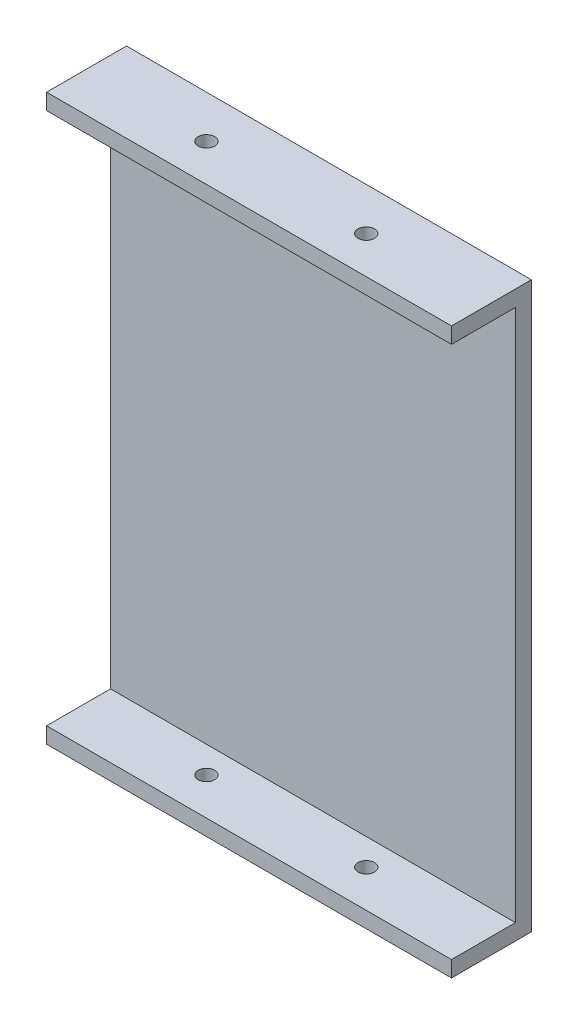
ISO-10303-21;
HEADER;
FILE_DESCRIPTION(('STEP AP214'),'2;1');
FILE_NAME('part.step','',(''),(''),'','','');
FILE_SCHEMA(('AUTOMOTIVE_DESIGN { 1 0 10303 214 1 1 1 1 }'));
ENDSEC;
DATA;
#1=APPLICATION_CONTEXT('core data for automotive mechanical design processes');
#2=APPLICATION_PROTOCOL_DEFINITION('international standard','automotive_design',2000,#1);
#3=PRODUCT_CONTEXT('',#1,'mechanical');
#4=PRODUCT('Part','Part','',(#3));
#5=PRODUCT_RELATED_PRODUCT_CATEGORY('part','',(#4));
#6=PRODUCT_DEFINITION_FORMATION('','',#4);
#7=PRODUCT_DEFINITION_CONTEXT('part definition',#1,'design');
#8=PRODUCT_DEFINITION('design','',#6,#7);
#9=PRODUCT_DEFINITION_SHAPE('','',#8);
#10=(LENGTH_UNIT() NAMED_UNIT(*) SI_UNIT(.MILLI.,.METRE.));
#11=(NAMED_UNIT(*) PLANE_ANGLE_UNIT() SI_UNIT($,.RADIAN.));
#12=(NAMED_UNIT(*) SI_UNIT($,.STERADIAN.) SOLID_ANGLE_UNIT());
#13=UNCERTAINTY_MEASURE_WITH_UNIT(LENGTH_MEASURE(1.E-05),#10,'distance_accuracy_value','');
#14=(GEOMETRIC_REPRESENTATION_CONTEXT(3) GLOBAL_UNCERTAINTY_ASSIGNED_CONTEXT((#13)) GLOBAL_UNIT_ASSIGNED_CONTEXT((#10,
#11,#12)) REPRESENTATION_CONTEXT('',''));
#15=CARTESIAN_POINT('',(0.,0.,0.));
#16=DIRECTION('',(0.,0.,1.));
#17=DIRECTION('',(1.,0.,0.));
#18=AXIS2_PLACEMENT_3D('',#15,#16,#17);
#19=CARTESIAN_POINT('',(0.,0.,3.));
#20=DIRECTION('',(0.,0.,-1.));
#21=DIRECTION('',(-1.,0.,0.));
#22=AXIS2_PLACEMENT_3D('',#19,#20,#21);
#23=PLANE('',#22);
#24=DIRECTION('',(-1.,0.,0.));
#25=VECTOR('',#24,1.);
#26=CARTESIAN_POINT('',(0.,45.,3.));
#27=LINE('',#26,#25);
#28=CARTESIAN_POINT('',(76.,45.,3.));
#29=VERTEX_POINT('',#28);
#30=CARTESIAN_POINT('',(0.,45.,3.));
#31=VERTEX_POINT('',#30);
#32=EDGE_CURVE('E62',#29,#31,#27,.T.);
#33=ORIENTED_EDGE('',*,*,#32,.F.);
#34=DIRECTION('',(0.,1.,0.));
#35=VECTOR('',#34,1.);
#36=CARTESIAN_POINT('',(76.,0.,3.));
#37=LINE('',#36,#35);
#38=CARTESIAN_POINT('',(76.,145.,3.));
#39=VERTEX_POINT('',#38);
#40=EDGE_CURVE('E11',#29,#39,#37,.T.);
#41=ORIENTED_EDGE('',*,*,#40,.T.);
#42=DIRECTION('',(1.,0.,0.));
#43=VECTOR('',#42,1.);
#44=CARTESIAN_POINT('',(0.,145.,3.));
#45=LINE('',#44,#43);
#46=CARTESIAN_POINT('',(0.,145.,3.));
#47=VERTEX_POINT('',#46);
#48=EDGE_CURVE('E197',#47,#39,#45,.T.);
#49=ORIENTED_EDGE('',*,*,#48,.F.);
#50=DIRECTION('',(0.,-1.,0.));
#51=VECTOR('',#50,1.);
#52=CARTESIAN_POINT('',(0.,0.,3.));
#53=LINE('',#52,#51);
#54=EDGE_CURVE('E55',#47,#31,#53,.T.);
#55=ORIENTED_EDGE('',*,*,#54,.T.);
#56=EDGE_LOOP('',(#33,#41,#49,#55));
#57=FACE_BOUND('',#56,.T.);
#58=ADVANCED_FACE('F45',(#57),#23,.F.);
#59=CARTESIAN_POINT('',(0.,0.,0.));
#60=DIRECTION('',(0.,0.,-1.));
#61=DIRECTION('',(-1.,0.,0.));
#62=AXIS2_PLACEMENT_3D('',#59,#60,#61);
#63=PLANE('',#62);
#64=DIRECTION('',(1.,0.,0.));
#65=VECTOR('',#64,1.);
#66=CARTESIAN_POINT('',(0.,42.,0.));
#67=LINE('',#66,#65);
#68=CARTESIAN_POINT('',(0.,42.,0.));
#69=VERTEX_POINT('',#68);
#70=CARTESIAN_POINT('',(76.,42.,0.));
#71=VERTEX_POINT('',#70);
#72=EDGE_CURVE('E132',#69,#71,#67,.T.);
#73=ORIENTED_EDGE('',*,*,#72,.F.);
#74=DIRECTION('',(0.,-1.,0.));
#75=VECTOR('',#74,1.);
#76=CARTESIAN_POINT('',(0.,0.,0.));
#77=LINE('',#76,#75);
#78=CARTESIAN_POINT('',(0.,148.,0.));
#79=VERTEX_POINT('',#78);
#80=EDGE_CURVE('E114',#79,#69,#77,.T.);
#81=ORIENTED_EDGE('',*,*,#80,.F.);
#82=DIRECTION('',(-1.,0.,0.));
#83=VECTOR('',#82,1.);
#84=CARTESIAN_POINT('',(0.,148.,0.));
#85=LINE('',#84,#83);
#86=CARTESIAN_POINT('',(76.,148.,0.));
#87=VERTEX_POINT('',#86);
#88=EDGE_CURVE('E125',#87,#79,#85,.T.);
#89=ORIENTED_EDGE('',*,*,#88,.F.);
#90=DIRECTION('',(0.,1.,0.));
#91=VECTOR('',#90,1.);
#92=CARTESIAN_POINT('',(76.,0.,0.));
#93=LINE('',#92,#91);
#94=EDGE_CURVE('E138',#71,#87,#93,.T.);
#95=ORIENTED_EDGE('',*,*,#94,.F.);
#96=EDGE_LOOP('',(#73,#81,#89,#95));
#97=FACE_BOUND('',#96,.T.);
#98=ADVANCED_FACE('F135',(#97),#63,.T.);
#99=CARTESIAN_POINT('',(0.,0.,3.));
#100=DIRECTION('',(1.,0.,0.));
#101=DIRECTION('',(0.,0.,-1.));
#102=AXIS2_PLACEMENT_3D('',#99,#100,#101);
#103=PLANE('',#102);
#104=ORIENTED_EDGE('',*,*,#80,.T.);
#105=DIRECTION('',(0.,0.,-1.));
#106=VECTOR('',#105,1.);
#107=CARTESIAN_POINT('',(0.,42.,15.));
#108=LINE('',#107,#106);
#109=CARTESIAN_POINT('',(0.,42.,15.));
#110=VERTEX_POINT('',#109);
#111=EDGE_CURVE('E139',#110,#69,#108,.T.);
#112=ORIENTED_EDGE('',*,*,#111,.F.);
#113=DIRECTION('',(0.,-1.,0.));
#114=VECTOR('',#113,1.);
#115=CARTESIAN_POINT('',(0.,45.,15.));
#116=LINE('',#115,#114);
#117=CARTESIAN_POINT('',(0.,45.,15.));
#118=VERTEX_POINT('',#117);
#119=EDGE_CURVE('E181',#118,#110,#116,.T.);
#120=ORIENTED_EDGE('',*,*,#119,.F.);
#121=DIRECTION('',(0.,0.,-1.));
#122=VECTOR('',#121,1.);
#123=CARTESIAN_POINT('',(0.,45.,15.));
#124=LINE('',#123,#122);
#125=EDGE_CURVE('E194',#118,#31,#124,.T.);
#126=ORIENTED_EDGE('',*,*,#125,.T.);
#127=ORIENTED_EDGE('',*,*,#54,.F.);
#128=DIRECTION('',(0.,0.,-1.));
#129=VECTOR('',#128,1.);
#130=CARTESIAN_POINT('',(0.,145.,15.));
#131=LINE('',#130,#129);
#132=CARTESIAN_POINT('',(0.,145.,15.));
#133=VERTEX_POINT('',#132);
#134=EDGE_CURVE('E180',#133,#47,#131,.T.);
#135=ORIENTED_EDGE('',*,*,#134,.F.);
#136=DIRECTION('',(0.,-1.,0.));
#137=VECTOR('',#136,1.);
#138=CARTESIAN_POINT('',(0.,148.,15.));
#139=LINE('',#138,#137);
#140=CARTESIAN_POINT('',(0.,148.,15.));
#141=VERTEX_POINT('',#140);
#142=EDGE_CURVE('E117',#141,#133,#139,.T.);
#143=ORIENTED_EDGE('',*,*,#142,.F.);
#144=DIRECTION('',(0.,0.,-1.));
#145=VECTOR('',#144,1.);
#146=CARTESIAN_POINT('',(0.,148.,15.));
#147=LINE('',#146,#145);
#148=EDGE_CURVE('E110',#141,#79,#147,.T.);
#149=ORIENTED_EDGE('',*,*,#148,.T.);
#150=EDGE_LOOP('',(#104,#112,#120,#126,#127,#135,#143,#149));
#151=FACE_BOUND('',#150,.T.);
#152=ADVANCED_FACE('F47',(#151),#103,.F.);
#153=CARTESIAN_POINT('',(76.,0.,3.));
#154=DIRECTION('',(-1.,0.,0.));
#155=DIRECTION('',(0.,0.,1.));
#156=AXIS2_PLACEMENT_3D('',#153,#154,#155);
#157=PLANE('',#156);
#158=DIRECTION('',(0.,0.,-1.));
#159=VECTOR('',#158,1.);
#160=CARTESIAN_POINT('',(76.,42.,15.));
#161=LINE('',#160,#159);
#162=CARTESIAN_POINT('',(76.,42.,15.));
#163=VERTEX_POINT('',#162);
#164=EDGE_CURVE('E144',#163,#71,#161,.T.);
#165=ORIENTED_EDGE('',*,*,#164,.T.);
#166=ORIENTED_EDGE('',*,*,#94,.T.);
#167=DIRECTION('',(0.,0.,-1.));
#168=VECTOR('',#167,1.);
#169=CARTESIAN_POINT('',(76.,148.,15.));
#170=LINE('',#169,#168);
#171=CARTESIAN_POINT('',(76.,148.,15.));
#172=VERTEX_POINT('',#171);
#173=EDGE_CURVE('E122',#172,#87,#170,.T.);
#174=ORIENTED_EDGE('',*,*,#173,.F.);
#175=DIRECTION('',(0.,1.,0.));
#176=VECTOR('',#175,1.);
#177=CARTESIAN_POINT('',(76.,148.,15.));
#178=LINE('',#177,#176);
#179=CARTESIAN_POINT('',(76.,145.,15.));
#180=VERTEX_POINT('',#179);
#181=EDGE_CURVE('E221',#180,#172,#178,.T.);
#182=ORIENTED_EDGE('',*,*,#181,.F.);
#183=DIRECTION('',(0.,0.,-1.));
#184=VECTOR('',#183,1.);
#185=CARTESIAN_POINT('',(76.,145.,15.));
#186=LINE('',#185,#184);
#187=EDGE_CURVE('E210',#180,#39,#186,.T.);
#188=ORIENTED_EDGE('',*,*,#187,.T.);
#189=ORIENTED_EDGE('',*,*,#40,.F.);
#190=DIRECTION('',(0.,0.,-1.));
#191=VECTOR('',#190,1.);
#192=CARTESIAN_POINT('',(76.,45.,15.));
#193=LINE('',#192,#191);
#194=CARTESIAN_POINT('',(76.,45.,15.));
#195=VERTEX_POINT('',#194);
#196=EDGE_CURVE('E201',#195,#29,#193,.T.);
#197=ORIENTED_EDGE('',*,*,#196,.F.);
#198=DIRECTION('',(0.,1.,0.));
#199=VECTOR('',#198,1.);
#200=CARTESIAN_POINT('',(76.,45.,15.));
#201=LINE('',#200,#199);
#202=EDGE_CURVE('E188',#163,#195,#201,.T.);
#203=ORIENTED_EDGE('',*,*,#202,.F.);
#204=EDGE_LOOP('',(#165,#166,#174,#182,#188,#189,#197,#203));
#205=FACE_BOUND('',#204,.T.);
#206=ADVANCED_FACE('F236',(#205),#157,.F.);
#207=CARTESIAN_POINT('',(0.,145.,15.));
#208=DIRECTION('',(0.,1.,0.));
#209=DIRECTION('',(0.,0.,1.));
#210=AXIS2_PLACEMENT_3D('',#207,#208,#209);
#211=PLANE('',#210);
#212=CARTESIAN_POINT('',(23.,145.,8.));
#213=DIRECTION('',(0.,1.,0.));
#214=DIRECTION('',(0.,0.,1.));
#215=AXIS2_PLACEMENT_3D('',#212,#213,#214);
#216=CIRCLE('',#215,1.55);
#217=CARTESIAN_POINT('',(23.,145.,9.55));
#218=VERTEX_POINT('',#217);
#219=EDGE_CURVE('E176',#218,#218,#216,.T.);
#220=ORIENTED_EDGE('',*,*,#219,.T.);
#221=EDGE_LOOP('',(#220));
#222=FACE_BOUND('',#221,.T.);
#223=CARTESIAN_POINT('',(53.,145.,8.));
#224=DIRECTION('',(0.,1.,0.));
#225=DIRECTION('',(0.,0.,1.));
#226=AXIS2_PLACEMENT_3D('',#223,#224,#225);
#227=CIRCLE('',#226,1.55);
#228=CARTESIAN_POINT('',(53.,145.,9.55));
#229=VERTEX_POINT('',#228);
#230=EDGE_CURVE('E157',#229,#229,#227,.T.);
#231=ORIENTED_EDGE('',*,*,#230,.T.);
#232=EDGE_LOOP('',(#231));
#233=FACE_BOUND('',#232,.T.);
#234=ORIENTED_EDGE('',*,*,#48,.T.);
#235=ORIENTED_EDGE('',*,*,#187,.F.);
#236=DIRECTION('',(1.,0.,0.));
#237=VECTOR('',#236,1.);
#238=CARTESIAN_POINT('',(0.,145.,15.));
#239=LINE('',#238,#237);
#240=EDGE_CURVE('E224',#133,#180,#239,.T.);
#241=ORIENTED_EDGE('',*,*,#240,.F.);
#242=ORIENTED_EDGE('',*,*,#134,.T.);
#243=EDGE_LOOP('',(#234,#235,#241,#242));
#244=FACE_BOUND('',#243,.T.);
#245=ADVANCED_FACE('F233',(#222,#233,#244),#211,.F.);
#246=CARTESIAN_POINT('',(0.,148.,15.));
#247=DIRECTION('',(0.,-1.,0.));
#248=DIRECTION('',(0.,0.,-1.));
#249=AXIS2_PLACEMENT_3D('',#246,#247,#248);
#250=PLANE('',#249);
#251=CARTESIAN_POINT('',(23.,148.,8.));
#252=DIRECTION('',(0.,-1.,0.));
#253=DIRECTION('',(0.,0.,-1.));
#254=AXIS2_PLACEMENT_3D('',#251,#252,#253);
#255=CIRCLE('',#254,1.55);
#256=CARTESIAN_POINT('',(23.,148.,6.45));
#257=VERTEX_POINT('',#256);
#258=EDGE_CURVE('E172',#257,#257,#255,.T.);
#259=ORIENTED_EDGE('',*,*,#258,.T.);
#260=EDGE_LOOP('',(#259));
#261=FACE_BOUND('',#260,.T.);
#262=CARTESIAN_POINT('',(53.,148.,8.));
#263=DIRECTION('',(0.,-1.,0.));
#264=DIRECTION('',(0.,0.,-1.));
#265=AXIS2_PLACEMENT_3D('',#262,#263,#264);
#266=CIRCLE('',#265,1.55);
#267=CARTESIAN_POINT('',(53.,148.,6.45));
#268=VERTEX_POINT('',#267);
#269=EDGE_CURVE('E150',#268,#268,#266,.T.);
#270=ORIENTED_EDGE('',*,*,#269,.T.);
#271=EDGE_LOOP('',(#270));
#272=FACE_BOUND('',#271,.T.);
#273=ORIENTED_EDGE('',*,*,#173,.T.);
#274=ORIENTED_EDGE('',*,*,#88,.T.);
#275=ORIENTED_EDGE('',*,*,#148,.F.);
#276=DIRECTION('',(-1.,0.,0.));
#277=VECTOR('',#276,1.);
#278=CARTESIAN_POINT('',(0.,148.,15.));
#279=LINE('',#278,#277);
#280=EDGE_CURVE('E121',#172,#141,#279,.T.);
#281=ORIENTED_EDGE('',*,*,#280,.F.);
#282=EDGE_LOOP('',(#273,#274,#275,#281));
#283=FACE_BOUND('',#282,.T.);
#284=ADVANCED_FACE('F126',(#261,#272,#283),#250,.F.);
#285=CARTESIAN_POINT('',(0.,0.,15.));
#286=DIRECTION('',(0.,0.,1.));
#287=DIRECTION('',(1.,0.,0.));
#288=AXIS2_PLACEMENT_3D('',#285,#286,#287);
#289=PLANE('',#288);
#290=ORIENTED_EDGE('',*,*,#142,.T.);
#291=ORIENTED_EDGE('',*,*,#240,.T.);
#292=ORIENTED_EDGE('',*,*,#181,.T.);
#293=ORIENTED_EDGE('',*,*,#280,.T.);
#294=EDGE_LOOP('',(#290,#291,#292,#293));
#295=FACE_BOUND('',#294,.T.);
#296=ADVANCED_FACE('F230',(#295),#289,.T.);
#297=CARTESIAN_POINT('',(0.,42.,15.));
#298=DIRECTION('',(0.,1.,0.));
#299=DIRECTION('',(0.,0.,1.));
#300=AXIS2_PLACEMENT_3D('',#297,#298,#299);
#301=PLANE('',#300);
#302=CARTESIAN_POINT('',(23.,42.,8.));
#303=DIRECTION('',(0.,-1.,0.));
#304=DIRECTION('',(0.,0.,-1.));
#305=AXIS2_PLACEMENT_3D('',#302,#303,#304);
#306=CIRCLE('',#305,1.55);
#307=CARTESIAN_POINT('',(23.,42.,6.45));
#308=VERTEX_POINT('',#307);
#309=EDGE_CURVE('E151',#308,#308,#306,.T.);
#310=ORIENTED_EDGE('',*,*,#309,.F.);
#311=EDGE_LOOP('',(#310));
#312=FACE_BOUND('',#311,.T.);
#313=CARTESIAN_POINT('',(53.,42.,8.));
#314=DIRECTION('',(0.,-1.,0.));
#315=DIRECTION('',(0.,0.,-1.));
#316=AXIS2_PLACEMENT_3D('',#313,#314,#315);
#317=CIRCLE('',#316,1.55);
#318=CARTESIAN_POINT('',(53.,42.,6.45));
#319=VERTEX_POINT('',#318);
#320=EDGE_CURVE('E160',#319,#319,#317,.T.);
#321=ORIENTED_EDGE('',*,*,#320,.F.);
#322=EDGE_LOOP('',(#321));
#323=FACE_BOUND('',#322,.T.);
#324=ORIENTED_EDGE('',*,*,#111,.T.);
#325=ORIENTED_EDGE('',*,*,#72,.T.);
#326=ORIENTED_EDGE('',*,*,#164,.F.);
#327=DIRECTION('',(1.,0.,0.));
#328=VECTOR('',#327,1.);
#329=CARTESIAN_POINT('',(0.,42.,15.));
#330=LINE('',#329,#328);
#331=EDGE_CURVE('E185',#110,#163,#330,.T.);
#332=ORIENTED_EDGE('',*,*,#331,.F.);
#333=EDGE_LOOP('',(#324,#325,#326,#332));
#334=FACE_BOUND('',#333,.T.);
#335=ADVANCED_FACE('F241',(#312,#323,#334),#301,.F.);
#336=CARTESIAN_POINT('',(0.,45.,15.));
#337=DIRECTION('',(0.,-1.,0.));
#338=DIRECTION('',(0.,0.,-1.));
#339=AXIS2_PLACEMENT_3D('',#336,#337,#338);
#340=PLANE('',#339);
#341=CARTESIAN_POINT('',(23.,45.,8.));
#342=DIRECTION('',(0.,-1.,0.));
#343=DIRECTION('',(0.,0.,-1.));
#344=AXIS2_PLACEMENT_3D('',#341,#342,#343);
#345=CIRCLE('',#344,1.55);
#346=CARTESIAN_POINT('',(23.,45.,6.45));
#347=VERTEX_POINT('',#346);
#348=EDGE_CURVE('E49',#347,#347,#345,.T.);
#349=ORIENTED_EDGE('',*,*,#348,.T.);
#350=EDGE_LOOP('',(#349));
#351=FACE_BOUND('',#350,.T.);
#352=CARTESIAN_POINT('',(53.,45.,8.));
#353=DIRECTION('',(0.,-1.,0.));
#354=DIRECTION('',(0.,0.,-1.));
#355=AXIS2_PLACEMENT_3D('',#352,#353,#354);
#356=CIRCLE('',#355,1.55);
#357=CARTESIAN_POINT('',(53.,45.,6.45));
#358=VERTEX_POINT('',#357);
#359=EDGE_CURVE('E147',#358,#358,#356,.T.);
#360=ORIENTED_EDGE('',*,*,#359,.T.);
#361=EDGE_LOOP('',(#360));
#362=FACE_BOUND('',#361,.T.);
#363=ORIENTED_EDGE('',*,*,#32,.T.);
#364=ORIENTED_EDGE('',*,*,#125,.F.);
#365=DIRECTION('',(-1.,0.,0.));
#366=VECTOR('',#365,1.);
#367=CARTESIAN_POINT('',(0.,45.,15.));
#368=LINE('',#367,#366);
#369=EDGE_CURVE('E191',#195,#118,#368,.T.);
#370=ORIENTED_EDGE('',*,*,#369,.F.);
#371=ORIENTED_EDGE('',*,*,#196,.T.);
#372=EDGE_LOOP('',(#363,#364,#370,#371));
#373=FACE_BOUND('',#372,.T.);
#374=ADVANCED_FACE('F249',(#351,#362,#373),#340,.F.);
#375=CARTESIAN_POINT('',(0.,0.,15.));
#376=DIRECTION('',(0.,0.,1.));
#377=DIRECTION('',(1.,0.,0.));
#378=AXIS2_PLACEMENT_3D('',#375,#376,#377);
#379=PLANE('',#378);
#380=ORIENTED_EDGE('',*,*,#119,.T.);
#381=ORIENTED_EDGE('',*,*,#331,.T.);
#382=ORIENTED_EDGE('',*,*,#202,.T.);
#383=ORIENTED_EDGE('',*,*,#369,.T.);
#384=EDGE_LOOP('',(#380,#381,#382,#383));
#385=FACE_BOUND('',#384,.T.);
#386=ADVANCED_FACE('F246',(#385),#379,.T.);
#387=CARTESIAN_POINT('',(53.,190.,8.));
#388=DIRECTION('',(0.,-1.,0.));
#389=DIRECTION('',(0.,0.,-1.));
#390=AXIS2_PLACEMENT_3D('',#387,#388,#389);
#391=CYLINDRICAL_SURFACE('',#390,1.55);
#392=ORIENTED_EDGE('',*,*,#320,.T.);
#393=EDGE_LOOP('',(#392));
#394=FACE_BOUND('',#393,.T.);
#395=ORIENTED_EDGE('',*,*,#359,.F.);
#396=EDGE_LOOP('',(#395));
#397=FACE_BOUND('',#396,.T.);
#398=ADVANCED_FACE('F297',(#394,#397),#391,.F.);
#399=CARTESIAN_POINT('',(23.,190.,8.));
#400=DIRECTION('',(0.,-1.,0.));
#401=DIRECTION('',(0.,0.,-1.));
#402=AXIS2_PLACEMENT_3D('',#399,#400,#401);
#403=CYLINDRICAL_SURFACE('',#402,1.55);
#404=ORIENTED_EDGE('',*,*,#309,.T.);
#405=EDGE_LOOP('',(#404));
#406=FACE_BOUND('',#405,.T.);
#407=ORIENTED_EDGE('',*,*,#348,.F.);
#408=EDGE_LOOP('',(#407));
#409=FACE_BOUND('',#408,.T.);
#410=ADVANCED_FACE('F287',(#406,#409),#403,.F.);
#411=ORIENTED_EDGE('',*,*,#269,.F.);
#412=EDGE_LOOP('',(#411));
#413=FACE_BOUND('',#412,.T.);
#414=ORIENTED_EDGE('',*,*,#230,.F.);
#415=EDGE_LOOP('',(#414));
#416=FACE_BOUND('',#415,.T.);
#417=ADVANCED_FACE('F284',(#413,#416),#391,.F.);
#418=ORIENTED_EDGE('',*,*,#258,.F.);
#419=EDGE_LOOP('',(#418));
#420=FACE_BOUND('',#419,.T.);
#421=ORIENTED_EDGE('',*,*,#219,.F.);
#422=EDGE_LOOP('',(#421));
#423=FACE_BOUND('',#422,.T.);
#424=ADVANCED_FACE('F280',(#420,#423),#403,.F.);
#425=CLOSED_SHELL('',(#58,#98,#152,#206,#245,#284,#296,#335,#374,#386,#398,#410,#417,#424));
#426=MANIFOLD_SOLID_BREP('B2',#425);
#427=ADVANCED_BREP_SHAPE_REPRESENTATION('',(#18,#426),#14);
#428=SHAPE_DEFINITION_REPRESENTATION(#9,#427);
ENDSEC;
END-ISO-10303-21;
